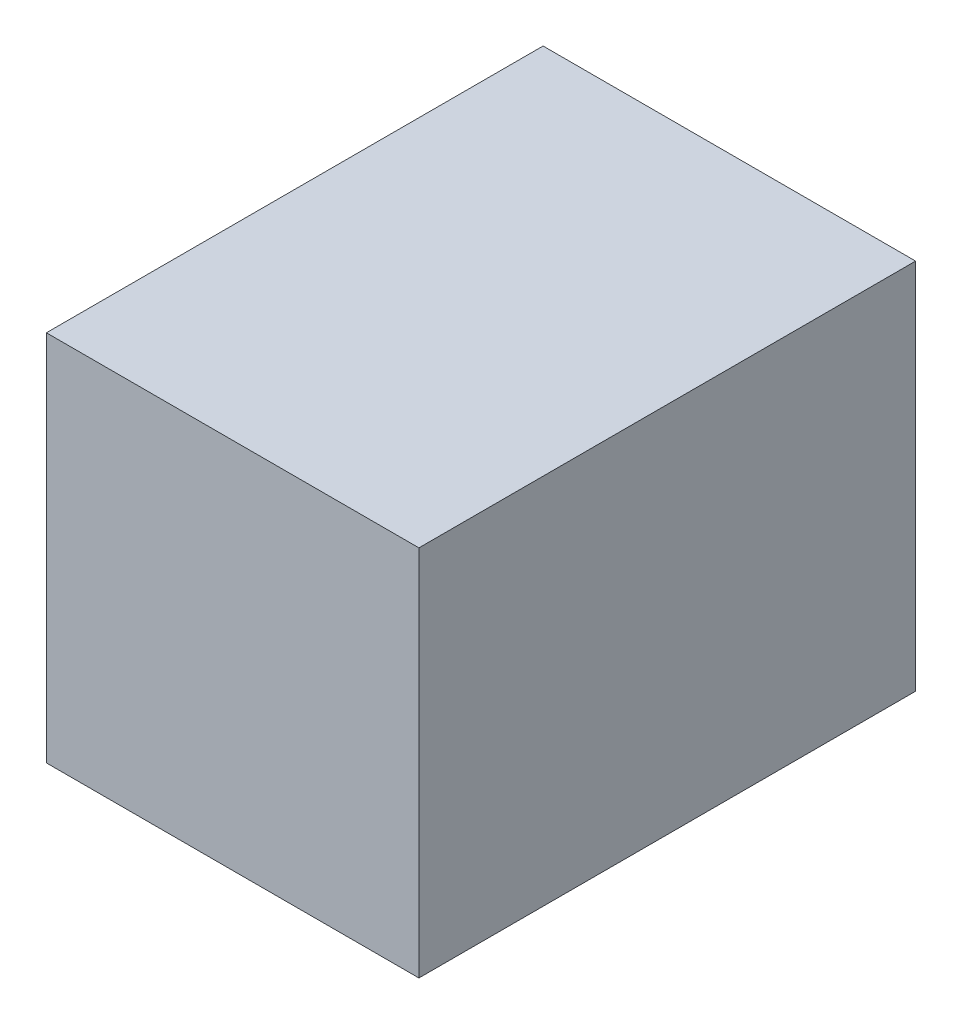
ISO-10303-21;
HEADER;
FILE_DESCRIPTION(('STEP AP214'),'2;1');
FILE_NAME('part.step','',(''),(''),'','','');
FILE_SCHEMA(('AUTOMOTIVE_DESIGN { 1 0 10303 214 1 1 1 1 }'));
ENDSEC;
DATA;
#1=APPLICATION_CONTEXT('core data for automotive mechanical design processes');
#2=APPLICATION_PROTOCOL_DEFINITION('international standard','automotive_design',2000,#1);
#3=PRODUCT_CONTEXT('',#1,'mechanical');
#4=PRODUCT('Part','Part','',(#3));
#5=PRODUCT_RELATED_PRODUCT_CATEGORY('part','',(#4));
#6=PRODUCT_DEFINITION_FORMATION('','',#4);
#7=PRODUCT_DEFINITION_CONTEXT('part definition',#1,'design');
#8=PRODUCT_DEFINITION('design','',#6,#7);
#9=PRODUCT_DEFINITION_SHAPE('','',#8);
#10=(LENGTH_UNIT() NAMED_UNIT(*) SI_UNIT(.MILLI.,.METRE.));
#11=(NAMED_UNIT(*) PLANE_ANGLE_UNIT() SI_UNIT($,.RADIAN.));
#12=(NAMED_UNIT(*) SI_UNIT($,.STERADIAN.) SOLID_ANGLE_UNIT());
#13=UNCERTAINTY_MEASURE_WITH_UNIT(LENGTH_MEASURE(1.E-05),#10,'distance_accuracy_value','');
#14=(GEOMETRIC_REPRESENTATION_CONTEXT(3) GLOBAL_UNCERTAINTY_ASSIGNED_CONTEXT((#13)) GLOBAL_UNIT_ASSIGNED_CONTEXT((#10,
#11,#12)) REPRESENTATION_CONTEXT('',''));
#15=CARTESIAN_POINT('',(0.,0.,0.));
#16=DIRECTION('',(0.,0.,1.));
#17=DIRECTION('',(1.,0.,0.));
#18=AXIS2_PLACEMENT_3D('',#15,#16,#17);
#19=CARTESIAN_POINT('',(750.,1500.,1000.));
#20=DIRECTION('',(-1.,0.,0.));
#21=DIRECTION('',(0.,0.,1.));
#22=AXIS2_PLACEMENT_3D('',#19,#20,#21);
#23=PLANE('',#22);
#24=DIRECTION('',(0.,0.,-1.));
#25=VECTOR('',#24,1.);
#26=CARTESIAN_POINT('',(750.,0.,1000.));
#27=LINE('',#26,#25);
#28=CARTESIAN_POINT('',(750.,0.,1000.));
#29=VERTEX_POINT('',#28);
#30=CARTESIAN_POINT('',(750.,0.,-1000.));
#31=VERTEX_POINT('',#30);
#32=EDGE_CURVE('E107',#29,#31,#27,.T.);
#33=ORIENTED_EDGE('',*,*,#32,.T.);
#34=DIRECTION('',(0.,-1.,0.));
#35=VECTOR('',#34,1.);
#36=CARTESIAN_POINT('',(750.,1500.,-1000.));
#37=LINE('',#36,#35);
#38=CARTESIAN_POINT('',(750.,1500.,-1000.));
#39=VERTEX_POINT('',#38);
#40=EDGE_CURVE('E11',#39,#31,#37,.T.);
#41=ORIENTED_EDGE('',*,*,#40,.F.);
#42=DIRECTION('',(0.,0.,-1.));
#43=VECTOR('',#42,1.);
#44=CARTESIAN_POINT('',(750.,1500.,1000.));
#45=LINE('',#44,#43);
#46=CARTESIAN_POINT('',(750.,1500.,1000.));
#47=VERTEX_POINT('',#46);
#48=EDGE_CURVE('E91',#47,#39,#45,.T.);
#49=ORIENTED_EDGE('',*,*,#48,.F.);
#50=DIRECTION('',(0.,-1.,0.));
#51=VECTOR('',#50,1.);
#52=CARTESIAN_POINT('',(750.,1500.,1000.));
#53=LINE('',#52,#51);
#54=EDGE_CURVE('E103',#47,#29,#53,.T.);
#55=ORIENTED_EDGE('',*,*,#54,.T.);
#56=EDGE_LOOP('',(#33,#41,#49,#55));
#57=FACE_BOUND('',#56,.T.);
#58=ADVANCED_FACE('F39',(#57),#23,.F.);
#59=CARTESIAN_POINT('',(-750.,1500.,-1000.));
#60=DIRECTION('',(0.,0.,1.));
#61=DIRECTION('',(1.,0.,0.));
#62=AXIS2_PLACEMENT_3D('',#59,#60,#61);
#63=PLANE('',#62);
#64=DIRECTION('',(-1.,0.,0.));
#65=VECTOR('',#64,1.);
#66=CARTESIAN_POINT('',(-750.,0.,-1000.));
#67=LINE('',#66,#65);
#68=CARTESIAN_POINT('',(-750.,0.,-1000.));
#69=VERTEX_POINT('',#68);
#70=EDGE_CURVE('E96',#31,#69,#67,.T.);
#71=ORIENTED_EDGE('',*,*,#70,.T.);
#72=DIRECTION('',(0.,-1.,0.));
#73=VECTOR('',#72,1.);
#74=CARTESIAN_POINT('',(-750.,1500.,-1000.));
#75=LINE('',#74,#73);
#76=CARTESIAN_POINT('',(-750.,1500.,-1000.));
#77=VERTEX_POINT('',#76);
#78=EDGE_CURVE('E48',#77,#69,#75,.T.);
#79=ORIENTED_EDGE('',*,*,#78,.F.);
#80=DIRECTION('',(-1.,0.,0.));
#81=VECTOR('',#80,1.);
#82=CARTESIAN_POINT('',(-750.,1500.,-1000.));
#83=LINE('',#82,#81);
#84=EDGE_CURVE('E86',#39,#77,#83,.T.);
#85=ORIENTED_EDGE('',*,*,#84,.F.);
#86=ORIENTED_EDGE('',*,*,#40,.T.);
#87=EDGE_LOOP('',(#71,#79,#85,#86));
#88=FACE_BOUND('',#87,.T.);
#89=ADVANCED_FACE('F95',(#88),#63,.F.);
#90=CARTESIAN_POINT('',(-750.,1500.,1000.));
#91=DIRECTION('',(1.,0.,0.));
#92=DIRECTION('',(0.,0.,-1.));
#93=AXIS2_PLACEMENT_3D('',#90,#91,#92);
#94=PLANE('',#93);
#95=DIRECTION('',(0.,0.,1.));
#96=VECTOR('',#95,1.);
#97=CARTESIAN_POINT('',(-750.,0.,1000.));
#98=LINE('',#97,#96);
#99=CARTESIAN_POINT('',(-750.,0.,1000.));
#100=VERTEX_POINT('',#99);
#101=EDGE_CURVE('E73',#69,#100,#98,.T.);
#102=ORIENTED_EDGE('',*,*,#101,.T.);
#103=DIRECTION('',(0.,-1.,0.));
#104=VECTOR('',#103,1.);
#105=CARTESIAN_POINT('',(-750.,1500.,1000.));
#106=LINE('',#105,#104);
#107=CARTESIAN_POINT('',(-750.,1500.,1000.));
#108=VERTEX_POINT('',#107);
#109=EDGE_CURVE('E98',#108,#100,#106,.T.);
#110=ORIENTED_EDGE('',*,*,#109,.F.);
#111=DIRECTION('',(0.,0.,1.));
#112=VECTOR('',#111,1.);
#113=CARTESIAN_POINT('',(-750.,1500.,1000.));
#114=LINE('',#113,#112);
#115=EDGE_CURVE('E89',#77,#108,#114,.T.);
#116=ORIENTED_EDGE('',*,*,#115,.F.);
#117=ORIENTED_EDGE('',*,*,#78,.T.);
#118=EDGE_LOOP('',(#102,#110,#116,#117));
#119=FACE_BOUND('',#118,.T.);
#120=ADVANCED_FACE('F99',(#119),#94,.F.);
#121=CARTESIAN_POINT('',(-750.,1500.,1000.));
#122=DIRECTION('',(0.,0.,-1.));
#123=DIRECTION('',(-1.,0.,0.));
#124=AXIS2_PLACEMENT_3D('',#121,#122,#123);
#125=PLANE('',#124);
#126=DIRECTION('',(1.,0.,0.));
#127=VECTOR('',#126,1.);
#128=CARTESIAN_POINT('',(-750.,0.,1000.));
#129=LINE('',#128,#127);
#130=EDGE_CURVE('E79',#100,#29,#129,.T.);
#131=ORIENTED_EDGE('',*,*,#130,.T.);
#132=ORIENTED_EDGE('',*,*,#54,.F.);
#133=DIRECTION('',(1.,0.,0.));
#134=VECTOR('',#133,1.);
#135=CARTESIAN_POINT('',(-750.,1500.,1000.));
#136=LINE('',#135,#134);
#137=EDGE_CURVE('E56',#108,#47,#136,.T.);
#138=ORIENTED_EDGE('',*,*,#137,.F.);
#139=ORIENTED_EDGE('',*,*,#109,.T.);
#140=EDGE_LOOP('',(#131,#132,#138,#139));
#141=FACE_BOUND('',#140,.T.);
#142=ADVANCED_FACE('F120',(#141),#125,.F.);
#143=CARTESIAN_POINT('',(0.,1500.,0.));
#144=DIRECTION('',(0.,-1.,0.));
#145=DIRECTION('',(0.,0.,-1.));
#146=AXIS2_PLACEMENT_3D('',#143,#144,#145);
#147=PLANE('',#146);
#148=ORIENTED_EDGE('',*,*,#48,.T.);
#149=ORIENTED_EDGE('',*,*,#84,.T.);
#150=ORIENTED_EDGE('',*,*,#115,.T.);
#151=ORIENTED_EDGE('',*,*,#137,.T.);
#152=EDGE_LOOP('',(#148,#149,#150,#151));
#153=FACE_BOUND('',#152,.T.);
#154=ADVANCED_FACE('F87',(#153),#147,.F.);
#155=CARTESIAN_POINT('',(0.,0.,0.));
#156=DIRECTION('',(0.,-1.,0.));
#157=DIRECTION('',(0.,0.,-1.));
#158=AXIS2_PLACEMENT_3D('',#155,#156,#157);
#159=PLANE('',#158);
#160=ORIENTED_EDGE('',*,*,#32,.F.);
#161=ORIENTED_EDGE('',*,*,#130,.F.);
#162=ORIENTED_EDGE('',*,*,#101,.F.);
#163=ORIENTED_EDGE('',*,*,#70,.F.);
#164=EDGE_LOOP('',(#160,#161,#162,#163));
#165=FACE_BOUND('',#164,.T.);
#166=ADVANCED_FACE('F123',(#165),#159,.T.);
#167=CLOSED_SHELL('',(#58,#89,#120,#142,#154,#166));
#168=MANIFOLD_SOLID_BREP('B2',#167);
#169=ADVANCED_BREP_SHAPE_REPRESENTATION('',(#18,#168),#14);
#170=SHAPE_DEFINITION_REPRESENTATION(#9,#169);
ENDSEC;
END-ISO-10303-21;
